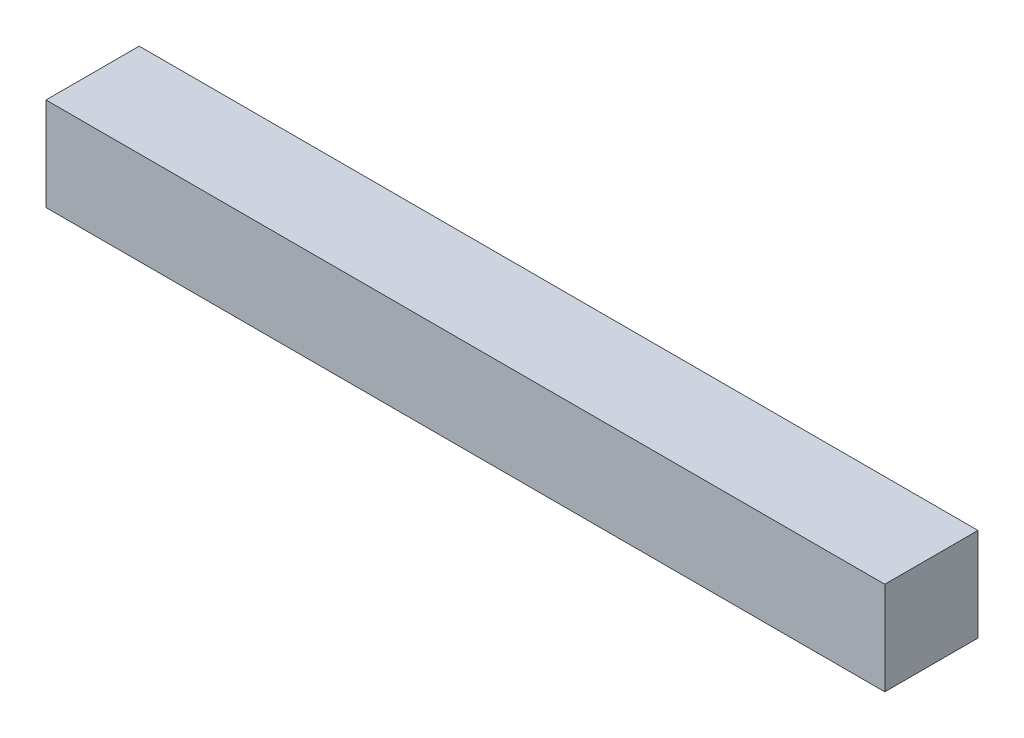
ISO-10303-21;
HEADER;
FILE_DESCRIPTION(('STEP AP214'),'2;1');
FILE_NAME('part.step','',(''),(''),'','','');
FILE_SCHEMA(('AUTOMOTIVE_DESIGN { 1 0 10303 214 1 1 1 1 }'));
ENDSEC;
DATA;
#1=APPLICATION_CONTEXT('core data for automotive mechanical design processes');
#2=APPLICATION_PROTOCOL_DEFINITION('international standard','automotive_design',2000,#1);
#3=PRODUCT_CONTEXT('',#1,'mechanical');
#4=PRODUCT('Part','Part','',(#3));
#5=PRODUCT_RELATED_PRODUCT_CATEGORY('part','',(#4));
#6=PRODUCT_DEFINITION_FORMATION('','',#4);
#7=PRODUCT_DEFINITION_CONTEXT('part definition',#1,'design');
#8=PRODUCT_DEFINITION('design','',#6,#7);
#9=PRODUCT_DEFINITION_SHAPE('','',#8);
#10=(LENGTH_UNIT() NAMED_UNIT(*) SI_UNIT(.MILLI.,.METRE.));
#11=(NAMED_UNIT(*) PLANE_ANGLE_UNIT() SI_UNIT($,.RADIAN.));
#12=(NAMED_UNIT(*) SI_UNIT($,.STERADIAN.) SOLID_ANGLE_UNIT());
#13=UNCERTAINTY_MEASURE_WITH_UNIT(LENGTH_MEASURE(1.E-05),#10,'distance_accuracy_value','');
#14=(GEOMETRIC_REPRESENTATION_CONTEXT(3) GLOBAL_UNCERTAINTY_ASSIGNED_CONTEXT((#13)) GLOBAL_UNIT_ASSIGNED_CONTEXT((#10,
#11,#12)) REPRESENTATION_CONTEXT('',''));
#15=CARTESIAN_POINT('',(0.,0.,0.));
#16=DIRECTION('',(0.,0.,1.));
#17=DIRECTION('',(1.,0.,0.));
#18=AXIS2_PLACEMENT_3D('',#15,#16,#17);
#19=CARTESIAN_POINT('',(164.414583378956,11.3881323454261,12.7));
#20=DIRECTION('',(0.,1.,0.));
#21=DIRECTION('',(-1.,0.,0.));
#22=AXIS2_PLACEMENT_3D('',#19,#20,#21);
#23=PLANE('',#22);
#24=DIRECTION('',(1.,0.,0.));
#25=VECTOR('',#24,1.);
#26=CARTESIAN_POINT('',(164.414583378956,11.3881323454261,0.));
#27=LINE('',#26,#25);
#28=CARTESIAN_POINT('',(50.1145833789565,11.3881323454261,0.));
#29=VERTEX_POINT('',#28);
#30=CARTESIAN_POINT('',(164.414583378956,11.3881323454261,0.));
#31=VERTEX_POINT('',#30);
#32=EDGE_CURVE('E79',#29,#31,#27,.T.);
#33=ORIENTED_EDGE('',*,*,#32,.T.);
#34=DIRECTION('',(0.,0.,-1.));
#35=VECTOR('',#34,1.);
#36=CARTESIAN_POINT('',(164.414583378956,11.3881323454261,12.7));
#37=LINE('',#36,#35);
#38=CARTESIAN_POINT('',(164.414583378956,11.3881323454261,12.7));
#39=VERTEX_POINT('',#38);
#40=EDGE_CURVE('E151',#39,#31,#37,.T.);
#41=ORIENTED_EDGE('',*,*,#40,.F.);
#42=DIRECTION('',(1.,0.,0.));
#43=VECTOR('',#42,1.);
#44=CARTESIAN_POINT('',(164.414583378956,11.3881323454261,12.7));
#45=LINE('',#44,#43);
#46=CARTESIAN_POINT('',(50.1145833789565,11.3881323454261,12.7));
#47=VERTEX_POINT('',#46);
#48=EDGE_CURVE('E58',#47,#39,#45,.T.);
#49=ORIENTED_EDGE('',*,*,#48,.F.);
#50=DIRECTION('',(0.,0.,-1.));
#51=VECTOR('',#50,1.);
#52=CARTESIAN_POINT('',(50.1145833789565,11.3881323454261,12.7));
#53=LINE('',#52,#51);
#54=EDGE_CURVE('E161',#47,#29,#53,.T.);
#55=ORIENTED_EDGE('',*,*,#54,.T.);
#56=EDGE_LOOP('',(#33,#41,#49,#55));
#57=FACE_BOUND('',#56,.T.);
#58=DIRECTION('',(1.,0.,0.));
#59=VECTOR('',#58,1.);
#60=CARTESIAN_POINT('',(0.,11.3881323454261,2.54));
#61=LINE('',#60,#59);
#62=CARTESIAN_POINT('',(52.6545833789565,11.3881323454261,2.54));
#63=VERTEX_POINT('',#62);
#64=CARTESIAN_POINT('',(161.874583378956,11.3881323454261,2.54));
#65=VERTEX_POINT('',#64);
#66=EDGE_CURVE('E132',#63,#65,#61,.T.);
#67=ORIENTED_EDGE('',*,*,#66,.F.);
#68=DIRECTION('',(0.,0.,-1.));
#69=VECTOR('',#68,1.);
#70=CARTESIAN_POINT('',(52.6545833789565,11.3881323454261,12.7));
#71=LINE('',#70,#69);
#72=CARTESIAN_POINT('',(52.6545833789565,11.3881323454261,10.16));
#73=VERTEX_POINT('',#72);
#74=EDGE_CURVE('E127',#73,#63,#71,.T.);
#75=ORIENTED_EDGE('',*,*,#74,.F.);
#76=DIRECTION('',(1.,0.,0.));
#77=VECTOR('',#76,1.);
#78=CARTESIAN_POINT('',(0.,11.3881323454261,10.16));
#79=LINE('',#78,#77);
#80=CARTESIAN_POINT('',(161.874583378956,11.3881323454261,10.16));
#81=VERTEX_POINT('',#80);
#82=EDGE_CURVE('E49',#73,#81,#79,.T.);
#83=ORIENTED_EDGE('',*,*,#82,.T.);
#84=DIRECTION('',(0.,0.,-1.));
#85=VECTOR('',#84,1.);
#86=CARTESIAN_POINT('',(161.874583378956,11.3881323454261,12.7));
#87=LINE('',#86,#85);
#88=EDGE_CURVE('E140',#81,#65,#87,.T.);
#89=ORIENTED_EDGE('',*,*,#88,.T.);
#90=EDGE_LOOP('',(#67,#75,#83,#89));
#91=FACE_BOUND('',#90,.T.);
#92=ADVANCED_FACE('F34',(#57,#91),#23,.F.);
#93=CARTESIAN_POINT('',(164.414583378956,24.0881323454261,12.7));
#94=DIRECTION('',(-1.,0.,0.));
#95=DIRECTION('',(0.,0.,1.));
#96=AXIS2_PLACEMENT_3D('',#93,#94,#95);
#97=PLANE('',#96);
#98=DIRECTION('',(0.,1.,0.));
#99=VECTOR('',#98,1.);
#100=CARTESIAN_POINT('',(164.414583378956,24.0881323454261,0.));
#101=LINE('',#100,#99);
#102=CARTESIAN_POINT('',(164.414583378956,24.0881323454261,0.));
#103=VERTEX_POINT('',#102);
#104=EDGE_CURVE('E152',#31,#103,#101,.T.);
#105=ORIENTED_EDGE('',*,*,#104,.T.);
#106=DIRECTION('',(0.,0.,-1.));
#107=VECTOR('',#106,1.);
#108=CARTESIAN_POINT('',(164.414583378956,24.0881323454261,12.7));
#109=LINE('',#108,#107);
#110=CARTESIAN_POINT('',(164.414583378956,24.0881323454261,12.7));
#111=VERTEX_POINT('',#110);
#112=EDGE_CURVE('E11',#111,#103,#109,.T.);
#113=ORIENTED_EDGE('',*,*,#112,.F.);
#114=DIRECTION('',(0.,1.,0.));
#115=VECTOR('',#114,1.);
#116=CARTESIAN_POINT('',(164.414583378956,24.0881323454261,12.7));
#117=LINE('',#116,#115);
#118=EDGE_CURVE('E145',#39,#111,#117,.T.);
#119=ORIENTED_EDGE('',*,*,#118,.F.);
#120=ORIENTED_EDGE('',*,*,#40,.T.);
#121=EDGE_LOOP('',(#105,#113,#119,#120));
#122=FACE_BOUND('',#121,.T.);
#123=ADVANCED_FACE('F36',(#122),#97,.F.);
#124=CARTESIAN_POINT('',(164.414583378956,24.0881323454261,12.7));
#125=DIRECTION('',(0.,-1.,0.));
#126=DIRECTION('',(1.,0.,0.));
#127=AXIS2_PLACEMENT_3D('',#124,#125,#126);
#128=PLANE('',#127);
#129=DIRECTION('',(-1.,0.,0.));
#130=VECTOR('',#129,1.);
#131=CARTESIAN_POINT('',(164.414583378956,24.0881323454261,0.));
#132=LINE('',#131,#130);
#133=CARTESIAN_POINT('',(50.1145833789565,24.0881323454261,0.));
#134=VERTEX_POINT('',#133);
#135=EDGE_CURVE('E155',#103,#134,#132,.T.);
#136=ORIENTED_EDGE('',*,*,#135,.T.);
#137=DIRECTION('',(0.,0.,-1.));
#138=VECTOR('',#137,1.);
#139=CARTESIAN_POINT('',(50.1145833789565,24.0881323454261,12.7));
#140=LINE('',#139,#138);
#141=CARTESIAN_POINT('',(50.1145833789565,24.0881323454261,12.7));
#142=VERTEX_POINT('',#141);
#143=EDGE_CURVE('E42',#142,#134,#140,.T.);
#144=ORIENTED_EDGE('',*,*,#143,.F.);
#145=DIRECTION('',(-1.,0.,0.));
#146=VECTOR('',#145,1.);
#147=CARTESIAN_POINT('',(164.414583378956,24.0881323454261,12.7));
#148=LINE('',#147,#146);
#149=EDGE_CURVE('E86',#111,#142,#148,.T.);
#150=ORIENTED_EDGE('',*,*,#149,.F.);
#151=ORIENTED_EDGE('',*,*,#112,.T.);
#152=EDGE_LOOP('',(#136,#144,#150,#151));
#153=FACE_BOUND('',#152,.T.);
#154=ADVANCED_FACE('F200',(#153),#128,.F.);
#155=CARTESIAN_POINT('',(50.1145833789565,24.0881323454261,12.7));
#156=DIRECTION('',(1.,0.,0.));
#157=DIRECTION('',(0.,1.,0.));
#158=AXIS2_PLACEMENT_3D('',#155,#156,#157);
#159=PLANE('',#158);
#160=DIRECTION('',(0.,-1.,0.));
#161=VECTOR('',#160,1.);
#162=CARTESIAN_POINT('',(50.1145833789565,24.0881323454261,0.));
#163=LINE('',#162,#161);
#164=EDGE_CURVE('E157',#134,#29,#163,.T.);
#165=ORIENTED_EDGE('',*,*,#164,.T.);
#166=ORIENTED_EDGE('',*,*,#54,.F.);
#167=DIRECTION('',(0.,-1.,0.));
#168=VECTOR('',#167,1.);
#169=CARTESIAN_POINT('',(50.1145833789565,24.0881323454261,12.7));
#170=LINE('',#169,#168);
#171=EDGE_CURVE('E148',#142,#47,#170,.T.);
#172=ORIENTED_EDGE('',*,*,#171,.F.);
#173=ORIENTED_EDGE('',*,*,#143,.T.);
#174=EDGE_LOOP('',(#165,#166,#172,#173));
#175=FACE_BOUND('',#174,.T.);
#176=ADVANCED_FACE('F166',(#175),#159,.F.);
#177=CARTESIAN_POINT('',(0.,0.,12.7));
#178=DIRECTION('',(0.,0.,-1.));
#179=DIRECTION('',(-1.,0.,0.));
#180=AXIS2_PLACEMENT_3D('',#177,#178,#179);
#181=PLANE('',#180);
#182=ORIENTED_EDGE('',*,*,#118,.T.);
#183=ORIENTED_EDGE('',*,*,#149,.T.);
#184=ORIENTED_EDGE('',*,*,#171,.T.);
#185=ORIENTED_EDGE('',*,*,#48,.T.);
#186=EDGE_LOOP('',(#182,#183,#184,#185));
#187=FACE_BOUND('',#186,.T.);
#188=ADVANCED_FACE('F194',(#187),#181,.F.);
#189=CARTESIAN_POINT('',(0.,0.,0.));
#190=DIRECTION('',(0.,0.,-1.));
#191=DIRECTION('',(-1.,0.,0.));
#192=AXIS2_PLACEMENT_3D('',#189,#190,#191);
#193=PLANE('',#192);
#194=ORIENTED_EDGE('',*,*,#104,.F.);
#195=ORIENTED_EDGE('',*,*,#32,.F.);
#196=ORIENTED_EDGE('',*,*,#164,.F.);
#197=ORIENTED_EDGE('',*,*,#135,.F.);
#198=EDGE_LOOP('',(#194,#195,#196,#197));
#199=FACE_BOUND('',#198,.T.);
#200=ADVANCED_FACE('F170',(#199),#193,.T.);
#201=CARTESIAN_POINT('',(161.874583378956,24.0881323454261,12.7));
#202=DIRECTION('',(-1.,0.,0.));
#203=DIRECTION('',(0.,0.,1.));
#204=AXIS2_PLACEMENT_3D('',#201,#202,#203);
#205=PLANE('',#204);
#206=DIRECTION('',(0.,1.,0.));
#207=VECTOR('',#206,1.);
#208=CARTESIAN_POINT('',(161.874583378956,0.,2.54));
#209=LINE('',#208,#207);
#210=CARTESIAN_POINT('',(161.874583378956,21.5481323454261,2.54));
#211=VERTEX_POINT('',#210);
#212=EDGE_CURVE('E116',#65,#211,#209,.T.);
#213=ORIENTED_EDGE('',*,*,#212,.F.);
#214=ORIENTED_EDGE('',*,*,#88,.F.);
#215=DIRECTION('',(0.,1.,0.));
#216=VECTOR('',#215,1.);
#217=CARTESIAN_POINT('',(161.874583378956,0.,10.16));
#218=LINE('',#217,#216);
#219=CARTESIAN_POINT('',(161.874583378956,21.5481323454261,10.16));
#220=VERTEX_POINT('',#219);
#221=EDGE_CURVE('E134',#81,#220,#218,.T.);
#222=ORIENTED_EDGE('',*,*,#221,.T.);
#223=DIRECTION('',(0.,0.,-1.));
#224=VECTOR('',#223,1.);
#225=CARTESIAN_POINT('',(161.874583378956,21.5481323454261,12.7));
#226=LINE('',#225,#224);
#227=EDGE_CURVE('E126',#220,#211,#226,.T.);
#228=ORIENTED_EDGE('',*,*,#227,.T.);
#229=EDGE_LOOP('',(#213,#214,#222,#228));
#230=FACE_BOUND('',#229,.T.);
#231=ADVANCED_FACE('F178',(#230),#205,.T.);
#232=CARTESIAN_POINT('',(164.414583378956,21.5481323454261,12.7));
#233=DIRECTION('',(0.,-1.,0.));
#234=DIRECTION('',(1.,0.,0.));
#235=AXIS2_PLACEMENT_3D('',#232,#233,#234);
#236=PLANE('',#235);
#237=DIRECTION('',(-1.,0.,0.));
#238=VECTOR('',#237,1.);
#239=CARTESIAN_POINT('',(0.,21.5481323454261,2.54));
#240=LINE('',#239,#238);
#241=CARTESIAN_POINT('',(52.6545833789565,21.5481323454261,2.54));
#242=VERTEX_POINT('',#241);
#243=EDGE_CURVE('E109',#211,#242,#240,.T.);
#244=ORIENTED_EDGE('',*,*,#243,.F.);
#245=ORIENTED_EDGE('',*,*,#227,.F.);
#246=DIRECTION('',(-1.,0.,0.));
#247=VECTOR('',#246,1.);
#248=CARTESIAN_POINT('',(0.,21.5481323454261,10.16));
#249=LINE('',#248,#247);
#250=CARTESIAN_POINT('',(52.6545833789565,21.5481323454261,10.16));
#251=VERTEX_POINT('',#250);
#252=EDGE_CURVE('E124',#220,#251,#249,.T.);
#253=ORIENTED_EDGE('',*,*,#252,.T.);
#254=DIRECTION('',(0.,0.,-1.));
#255=VECTOR('',#254,1.);
#256=CARTESIAN_POINT('',(52.6545833789565,21.5481323454261,12.7));
#257=LINE('',#256,#255);
#258=EDGE_CURVE('E122',#251,#242,#257,.T.);
#259=ORIENTED_EDGE('',*,*,#258,.T.);
#260=EDGE_LOOP('',(#244,#245,#253,#259));
#261=FACE_BOUND('',#260,.T.);
#262=ADVANCED_FACE('F123',(#261),#236,.T.);
#263=CARTESIAN_POINT('',(52.6545833789565,24.0881323454261,12.7));
#264=DIRECTION('',(1.,0.,0.));
#265=DIRECTION('',(0.,1.,0.));
#266=AXIS2_PLACEMENT_3D('',#263,#264,#265);
#267=PLANE('',#266);
#268=DIRECTION('',(0.,-1.,0.));
#269=VECTOR('',#268,1.);
#270=CARTESIAN_POINT('',(52.6545833789565,0.,2.54));
#271=LINE('',#270,#269);
#272=EDGE_CURVE('E113',#242,#63,#271,.T.);
#273=ORIENTED_EDGE('',*,*,#272,.F.);
#274=ORIENTED_EDGE('',*,*,#258,.F.);
#275=DIRECTION('',(0.,-1.,0.));
#276=VECTOR('',#275,1.);
#277=CARTESIAN_POINT('',(52.6545833789565,0.,10.16));
#278=LINE('',#277,#276);
#279=EDGE_CURVE('E138',#251,#73,#278,.T.);
#280=ORIENTED_EDGE('',*,*,#279,.T.);
#281=ORIENTED_EDGE('',*,*,#74,.T.);
#282=EDGE_LOOP('',(#273,#274,#280,#281));
#283=FACE_BOUND('',#282,.T.);
#284=ADVANCED_FACE('F129',(#283),#267,.T.);
#285=CARTESIAN_POINT('',(0.,0.,10.16));
#286=DIRECTION('',(0.,0.,-1.));
#287=DIRECTION('',(-1.,0.,0.));
#288=AXIS2_PLACEMENT_3D('',#285,#286,#287);
#289=PLANE('',#288);
#290=ORIENTED_EDGE('',*,*,#221,.F.);
#291=ORIENTED_EDGE('',*,*,#82,.F.);
#292=ORIENTED_EDGE('',*,*,#279,.F.);
#293=ORIENTED_EDGE('',*,*,#252,.F.);
#294=EDGE_LOOP('',(#290,#291,#292,#293));
#295=FACE_BOUND('',#294,.T.);
#296=ADVANCED_FACE('F183',(#295),#289,.T.);
#297=CARTESIAN_POINT('',(0.,0.,2.54));
#298=DIRECTION('',(0.,0.,-1.));
#299=DIRECTION('',(-1.,0.,0.));
#300=AXIS2_PLACEMENT_3D('',#297,#298,#299);
#301=PLANE('',#300);
#302=ORIENTED_EDGE('',*,*,#212,.T.);
#303=ORIENTED_EDGE('',*,*,#243,.T.);
#304=ORIENTED_EDGE('',*,*,#272,.T.);
#305=ORIENTED_EDGE('',*,*,#66,.T.);
#306=EDGE_LOOP('',(#302,#303,#304,#305));
#307=FACE_BOUND('',#306,.T.);
#308=ADVANCED_FACE('F111',(#307),#301,.F.);
#309=CLOSED_SHELL('',(#92,#123,#154,#176,#188,#200,#231,#262,#284,#296,#308));
#310=MANIFOLD_SOLID_BREP('B2',#309);
#311=ADVANCED_BREP_SHAPE_REPRESENTATION('',(#18,#310),#14);
#312=SHAPE_DEFINITION_REPRESENTATION(#9,#311);
ENDSEC;
END-ISO-10303-21;
